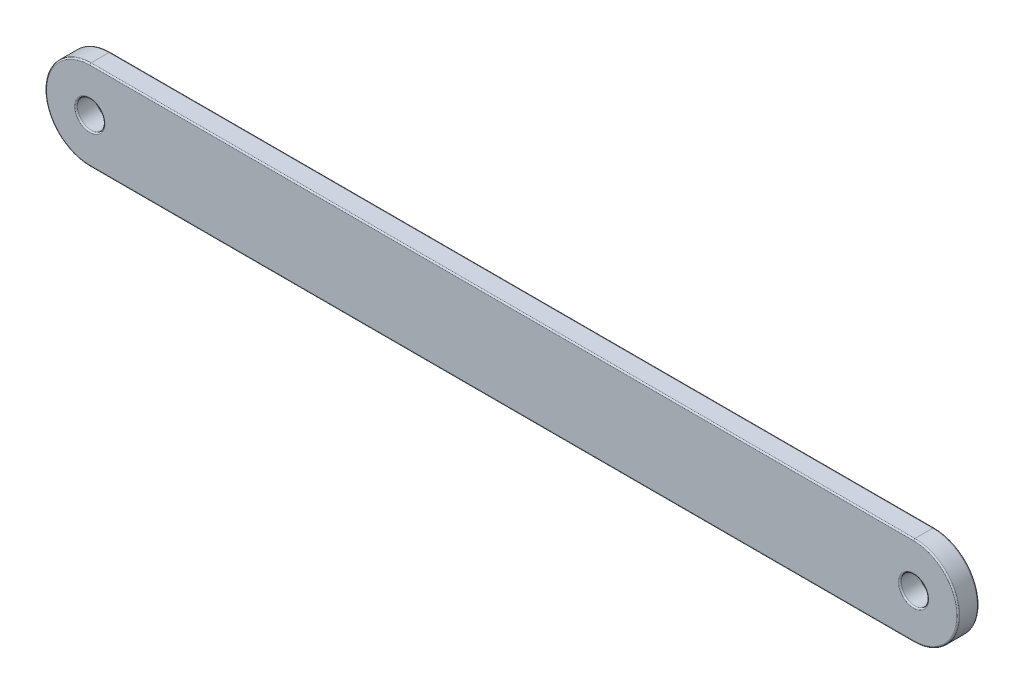
ISO-10303-21;
HEADER;
FILE_DESCRIPTION(('STEP AP214'),'2;1');
FILE_NAME('part.step','',(''),(''),'','','');
FILE_SCHEMA(('AUTOMOTIVE_DESIGN { 1 0 10303 214 1 1 1 1 }'));
ENDSEC;
DATA;
#1=APPLICATION_CONTEXT('core data for automotive mechanical design processes');
#2=APPLICATION_PROTOCOL_DEFINITION('international standard','automotive_design',2000,#1);
#3=PRODUCT_CONTEXT('',#1,'mechanical');
#4=PRODUCT('Part','Part','',(#3));
#5=PRODUCT_RELATED_PRODUCT_CATEGORY('part','',(#4));
#6=PRODUCT_DEFINITION_FORMATION('','',#4);
#7=PRODUCT_DEFINITION_CONTEXT('part definition',#1,'design');
#8=PRODUCT_DEFINITION('design','',#6,#7);
#9=PRODUCT_DEFINITION_SHAPE('','',#8);
#10=(LENGTH_UNIT() NAMED_UNIT(*) SI_UNIT(.MILLI.,.METRE.));
#11=(NAMED_UNIT(*) PLANE_ANGLE_UNIT() SI_UNIT($,.RADIAN.));
#12=(NAMED_UNIT(*) SI_UNIT($,.STERADIAN.) SOLID_ANGLE_UNIT());
#13=UNCERTAINTY_MEASURE_WITH_UNIT(LENGTH_MEASURE(1.E-05),#10,'distance_accuracy_value','');
#14=(GEOMETRIC_REPRESENTATION_CONTEXT(3) GLOBAL_UNCERTAINTY_ASSIGNED_CONTEXT((#13)) GLOBAL_UNIT_ASSIGNED_CONTEXT((#10,
#11,#12)) REPRESENTATION_CONTEXT('',''));
#15=CARTESIAN_POINT('',(0.,0.,0.));
#16=DIRECTION('',(0.,0.,1.));
#17=DIRECTION('',(1.,0.,0.));
#18=AXIS2_PLACEMENT_3D('',#15,#16,#17);
#19=CARTESIAN_POINT('',(-30.,0.,0.75));
#20=DIRECTION('',(0.,0.,1.));
#21=DIRECTION('',(1.,0.,0.));
#22=AXIS2_PLACEMENT_3D('',#19,#20,#21);
#23=PLANE('',#22);
#24=CARTESIAN_POINT('',(30.,0.,0.75));
#25=DIRECTION('',(0.,0.,1.));
#26=DIRECTION('',(1.,0.,0.));
#27=AXIS2_PLACEMENT_3D('',#24,#25,#26);
#28=CIRCLE('',#27,1.1);
#29=CARTESIAN_POINT('',(31.1,0.,0.75));
#30=VERTEX_POINT('',#29);
#31=EDGE_CURVE('E179',#30,#30,#28,.F.);
#32=ORIENTED_EDGE('',*,*,#31,.T.);
#33=EDGE_LOOP('',(#32));
#34=FACE_BOUND('',#33,.T.);
#35=CARTESIAN_POINT('',(-30.,0.,0.75));
#36=DIRECTION('',(0.,0.,1.));
#37=DIRECTION('',(1.,0.,0.));
#38=AXIS2_PLACEMENT_3D('',#35,#36,#37);
#39=CIRCLE('',#38,1.1);
#40=CARTESIAN_POINT('',(-28.9,0.,0.75));
#41=VERTEX_POINT('',#40);
#42=EDGE_CURVE('E175',#41,#41,#39,.F.);
#43=ORIENTED_EDGE('',*,*,#42,.T.);
#44=EDGE_LOOP('',(#43));
#45=FACE_BOUND('',#44,.T.);
#46=DIRECTION('',(-1.,0.,0.));
#47=VECTOR('',#46,1.);
#48=CARTESIAN_POINT('',(-30.,3.15,0.75));
#49=LINE('',#48,#47);
#50=CARTESIAN_POINT('',(30.,3.15000000000001,0.75));
#51=VERTEX_POINT('',#50);
#52=CARTESIAN_POINT('',(-30.,3.15,0.75));
#53=VERTEX_POINT('',#52);
#54=EDGE_CURVE('E162',#51,#53,#49,.T.);
#55=ORIENTED_EDGE('',*,*,#54,.T.);
#56=CARTESIAN_POINT('',(-30.,0.,0.75));
#57=DIRECTION('',(0.,0.,1.));
#58=DIRECTION('',(1.,0.,0.));
#59=AXIS2_PLACEMENT_3D('',#56,#57,#58);
#60=CIRCLE('',#59,3.15);
#61=CARTESIAN_POINT('',(-30.,-3.15,0.75));
#62=VERTEX_POINT('',#61);
#63=EDGE_CURVE('E171',#53,#62,#60,.T.);
#64=ORIENTED_EDGE('',*,*,#63,.T.);
#65=DIRECTION('',(1.,0.,0.));
#66=VECTOR('',#65,1.);
#67=CARTESIAN_POINT('',(30.,-3.14999999999999,0.75));
#68=LINE('',#67,#66);
#69=CARTESIAN_POINT('',(30.,-3.14999999999999,0.75));
#70=VERTEX_POINT('',#69);
#71=EDGE_CURVE('E168',#62,#70,#68,.T.);
#72=ORIENTED_EDGE('',*,*,#71,.T.);
#73=CARTESIAN_POINT('',(30.,0.,0.75));
#74=DIRECTION('',(0.,0.,1.));
#75=DIRECTION('',(1.,0.,0.));
#76=AXIS2_PLACEMENT_3D('',#73,#74,#75);
#77=CIRCLE('',#76,3.15);
#78=EDGE_CURVE('E165',#70,#51,#77,.T.);
#79=ORIENTED_EDGE('',*,*,#78,.T.);
#80=EDGE_LOOP('',(#55,#64,#72,#79));
#81=FACE_BOUND('',#80,.T.);
#82=ADVANCED_FACE('F43',(#34,#45,#81),#23,.T.);
#83=CARTESIAN_POINT('',(-30.,0.,-0.75));
#84=DIRECTION('',(0.,0.,1.));
#85=DIRECTION('',(1.,0.,0.));
#86=AXIS2_PLACEMENT_3D('',#83,#84,#85);
#87=PLANE('',#86);
#88=CARTESIAN_POINT('',(30.,0.,-0.75));
#89=DIRECTION('',(0.,0.,1.));
#90=DIRECTION('',(1.,0.,0.));
#91=AXIS2_PLACEMENT_3D('',#88,#89,#90);
#92=CIRCLE('',#91,1.1);
#93=CARTESIAN_POINT('',(31.1,0.,-0.75));
#94=VERTEX_POINT('',#93);
#95=EDGE_CURVE('E146',#94,#94,#92,.T.);
#96=ORIENTED_EDGE('',*,*,#95,.T.);
#97=EDGE_LOOP('',(#96));
#98=FACE_BOUND('',#97,.T.);
#99=CARTESIAN_POINT('',(-30.,0.,-0.75));
#100=DIRECTION('',(0.,0.,1.));
#101=DIRECTION('',(1.,0.,0.));
#102=AXIS2_PLACEMENT_3D('',#99,#100,#101);
#103=CIRCLE('',#102,1.1);
#104=CARTESIAN_POINT('',(-28.9,0.,-0.75));
#105=VERTEX_POINT('',#104);
#106=EDGE_CURVE('E141',#105,#105,#103,.T.);
#107=ORIENTED_EDGE('',*,*,#106,.T.);
#108=EDGE_LOOP('',(#107));
#109=FACE_BOUND('',#108,.T.);
#110=DIRECTION('',(1.,0.,0.));
#111=VECTOR('',#110,1.);
#112=CARTESIAN_POINT('',(-30.,-3.15,-0.75));
#113=LINE('',#112,#111);
#114=CARTESIAN_POINT('',(30.,-3.14999999999999,-0.75));
#115=VERTEX_POINT('',#114);
#116=CARTESIAN_POINT('',(-30.,-3.15,-0.75));
#117=VERTEX_POINT('',#116);
#118=EDGE_CURVE('E139',#115,#117,#113,.F.);
#119=ORIENTED_EDGE('',*,*,#118,.T.);
#120=CARTESIAN_POINT('',(-30.,0.,-0.75));
#121=DIRECTION('',(0.,0.,1.));
#122=DIRECTION('',(1.,0.,0.));
#123=AXIS2_PLACEMENT_3D('',#120,#121,#122);
#124=CIRCLE('',#123,3.15);
#125=CARTESIAN_POINT('',(-30.,3.15,-0.75));
#126=VERTEX_POINT('',#125);
#127=EDGE_CURVE('E116',#117,#126,#124,.F.);
#128=ORIENTED_EDGE('',*,*,#127,.T.);
#129=DIRECTION('',(-1.,0.,0.));
#130=VECTOR('',#129,1.);
#131=CARTESIAN_POINT('',(-30.,3.15,-0.75));
#132=LINE('',#131,#130);
#133=CARTESIAN_POINT('',(30.,3.15000000000001,-0.75));
#134=VERTEX_POINT('',#133);
#135=EDGE_CURVE('E127',#126,#134,#132,.F.);
#136=ORIENTED_EDGE('',*,*,#135,.T.);
#137=CARTESIAN_POINT('',(30.,0.,-0.75));
#138=DIRECTION('',(0.,0.,1.));
#139=DIRECTION('',(1.,0.,0.));
#140=AXIS2_PLACEMENT_3D('',#137,#138,#139);
#141=CIRCLE('',#140,3.15);
#142=EDGE_CURVE('E134',#134,#115,#141,.F.);
#143=ORIENTED_EDGE('',*,*,#142,.T.);
#144=EDGE_LOOP('',(#119,#128,#136,#143));
#145=FACE_BOUND('',#144,.T.);
#146=ADVANCED_FACE('F137',(#98,#109,#145),#87,.F.);
#147=CARTESIAN_POINT('',(-30.,0.,0.75));
#148=DIRECTION('',(0.,0.,-1.));
#149=DIRECTION('',(-1.,0.,0.));
#150=AXIS2_PLACEMENT_3D('',#147,#148,#149);
#151=CYLINDRICAL_SURFACE('',#150,3.25);
#152=DIRECTION('',(0.,0.,-1.));
#153=VECTOR('',#152,1.);
#154=CARTESIAN_POINT('',(-30.,3.25,0.75));
#155=LINE('',#154,#153);
#156=CARTESIAN_POINT('',(-30.,3.25,0.65));
#157=VERTEX_POINT('',#156);
#158=CARTESIAN_POINT('',(-30.,3.25,-0.65));
#159=VERTEX_POINT('',#158);
#160=EDGE_CURVE('E217',#157,#159,#155,.T.);
#161=ORIENTED_EDGE('',*,*,#160,.T.);
#162=CARTESIAN_POINT('',(-30.,0.,-0.65));
#163=DIRECTION('',(0.,0.,1.));
#164=DIRECTION('',(1.,0.,0.));
#165=AXIS2_PLACEMENT_3D('',#162,#163,#164);
#166=CIRCLE('',#165,3.25);
#167=CARTESIAN_POINT('',(-30.,-3.25,-0.65));
#168=VERTEX_POINT('',#167);
#169=EDGE_CURVE('E119',#159,#168,#166,.T.);
#170=ORIENTED_EDGE('',*,*,#169,.T.);
#171=DIRECTION('',(0.,0.,-1.));
#172=VECTOR('',#171,1.);
#173=CARTESIAN_POINT('',(-30.,-3.25,0.75));
#174=LINE('',#173,#172);
#175=CARTESIAN_POINT('',(-30.,-3.25,0.65));
#176=VERTEX_POINT('',#175);
#177=EDGE_CURVE('E135',#176,#168,#174,.T.);
#178=ORIENTED_EDGE('',*,*,#177,.F.);
#179=CARTESIAN_POINT('',(-30.,0.,0.65));
#180=DIRECTION('',(0.,0.,1.));
#181=DIRECTION('',(1.,0.,0.));
#182=AXIS2_PLACEMENT_3D('',#179,#180,#181);
#183=CIRCLE('',#182,3.25);
#184=EDGE_CURVE('E191',#176,#157,#183,.F.);
#185=ORIENTED_EDGE('',*,*,#184,.T.);
#186=EDGE_LOOP('',(#161,#170,#178,#185));
#187=FACE_BOUND('',#186,.T.);
#188=ADVANCED_FACE('F264',(#187),#151,.T.);
#189=CARTESIAN_POINT('',(-30.,-3.25,0.75));
#190=DIRECTION('',(0.,1.,0.));
#191=DIRECTION('',(-1.,0.,0.));
#192=AXIS2_PLACEMENT_3D('',#189,#190,#191);
#193=PLANE('',#192);
#194=ORIENTED_EDGE('',*,*,#177,.T.);
#195=DIRECTION('',(1.,0.,0.));
#196=VECTOR('',#195,1.);
#197=CARTESIAN_POINT('',(-30.,-3.25,-0.65));
#198=LINE('',#197,#196);
#199=CARTESIAN_POINT('',(30.,-3.24999999999999,-0.65));
#200=VERTEX_POINT('',#199);
#201=EDGE_CURVE('E200',#168,#200,#198,.T.);
#202=ORIENTED_EDGE('',*,*,#201,.T.);
#203=DIRECTION('',(0.,0.,-1.));
#204=VECTOR('',#203,1.);
#205=CARTESIAN_POINT('',(30.,-3.24999999999999,0.75));
#206=LINE('',#205,#204);
#207=CARTESIAN_POINT('',(30.,-3.24999999999999,0.65));
#208=VERTEX_POINT('',#207);
#209=EDGE_CURVE('E242',#208,#200,#206,.T.);
#210=ORIENTED_EDGE('',*,*,#209,.F.);
#211=DIRECTION('',(1.,0.,0.));
#212=VECTOR('',#211,1.);
#213=CARTESIAN_POINT('',(-30.,-3.25,0.65));
#214=LINE('',#213,#212);
#215=EDGE_CURVE('E197',#208,#176,#214,.F.);
#216=ORIENTED_EDGE('',*,*,#215,.T.);
#217=EDGE_LOOP('',(#194,#202,#210,#216));
#218=FACE_BOUND('',#217,.T.);
#219=ADVANCED_FACE('F246',(#218),#193,.F.);
#220=CARTESIAN_POINT('',(30.,0.,0.75));
#221=DIRECTION('',(0.,0.,-1.));
#222=DIRECTION('',(-1.,0.,0.));
#223=AXIS2_PLACEMENT_3D('',#220,#221,#222);
#224=CYLINDRICAL_SURFACE('',#223,3.25);
#225=ORIENTED_EDGE('',*,*,#209,.T.);
#226=CARTESIAN_POINT('',(30.,0.,-0.65));
#227=DIRECTION('',(0.,0.,1.));
#228=DIRECTION('',(1.,0.,0.));
#229=AXIS2_PLACEMENT_3D('',#226,#227,#228);
#230=CIRCLE('',#229,3.25);
#231=CARTESIAN_POINT('',(30.,3.25000000000001,-0.65));
#232=VERTEX_POINT('',#231);
#233=EDGE_CURVE('E61',#200,#232,#230,.T.);
#234=ORIENTED_EDGE('',*,*,#233,.T.);
#235=DIRECTION('',(0.,0.,-1.));
#236=VECTOR('',#235,1.);
#237=CARTESIAN_POINT('',(30.,3.25000000000001,0.75));
#238=LINE('',#237,#236);
#239=CARTESIAN_POINT('',(30.,3.25000000000001,0.65));
#240=VERTEX_POINT('',#239);
#241=EDGE_CURVE('E243',#240,#232,#238,.T.);
#242=ORIENTED_EDGE('',*,*,#241,.F.);
#243=CARTESIAN_POINT('',(30.,0.,0.65));
#244=DIRECTION('',(0.,0.,1.));
#245=DIRECTION('',(1.,0.,0.));
#246=AXIS2_PLACEMENT_3D('',#243,#244,#245);
#247=CIRCLE('',#246,3.25);
#248=EDGE_CURVE('E203',#240,#208,#247,.F.);
#249=ORIENTED_EDGE('',*,*,#248,.T.);
#250=EDGE_LOOP('',(#225,#234,#242,#249));
#251=FACE_BOUND('',#250,.T.);
#252=ADVANCED_FACE('F241',(#251),#224,.T.);
#253=CARTESIAN_POINT('',(-30.,3.25,0.75));
#254=DIRECTION('',(0.,-1.,0.));
#255=DIRECTION('',(1.,0.,0.));
#256=AXIS2_PLACEMENT_3D('',#253,#254,#255);
#257=PLANE('',#256);
#258=ORIENTED_EDGE('',*,*,#160,.F.);
#259=DIRECTION('',(-1.,0.,0.));
#260=VECTOR('',#259,1.);
#261=CARTESIAN_POINT('',(30.,3.25000000000001,0.65));
#262=LINE('',#261,#260);
#263=EDGE_CURVE('E11',#157,#240,#262,.F.);
#264=ORIENTED_EDGE('',*,*,#263,.T.);
#265=ORIENTED_EDGE('',*,*,#241,.T.);
#266=DIRECTION('',(-1.,0.,0.));
#267=VECTOR('',#266,1.);
#268=CARTESIAN_POINT('',(-30.,3.25,-0.65));
#269=LINE('',#268,#267);
#270=EDGE_CURVE('E53',#232,#159,#269,.T.);
#271=ORIENTED_EDGE('',*,*,#270,.T.);
#272=EDGE_LOOP('',(#258,#264,#265,#271));
#273=FACE_BOUND('',#272,.T.);
#274=ADVANCED_FACE('F267',(#273),#257,.F.);
#275=CARTESIAN_POINT('',(-30.,0.,0.75));
#276=DIRECTION('',(0.,0.,-1.));
#277=DIRECTION('',(-1.,0.,0.));
#278=AXIS2_PLACEMENT_3D('',#275,#276,#277);
#279=CYLINDRICAL_SURFACE('',#278,1.);
#280=CARTESIAN_POINT('',(-30.,0.,-0.65));
#281=DIRECTION('',(0.,0.,1.));
#282=DIRECTION('',(1.,0.,0.));
#283=AXIS2_PLACEMENT_3D('',#280,#281,#282);
#284=CIRCLE('',#283,1.);
#285=CARTESIAN_POINT('',(-29.,0.,-0.65));
#286=VERTEX_POINT('',#285);
#287=EDGE_CURVE('E187',#286,#286,#284,.F.);
#288=ORIENTED_EDGE('',*,*,#287,.T.);
#289=EDGE_LOOP('',(#288));
#290=FACE_BOUND('',#289,.T.);
#291=CARTESIAN_POINT('',(-30.,0.,0.65));
#292=DIRECTION('',(0.,0.,1.));
#293=DIRECTION('',(1.,0.,0.));
#294=AXIS2_PLACEMENT_3D('',#291,#292,#293);
#295=CIRCLE('',#294,1.);
#296=CARTESIAN_POINT('',(-29.,0.,0.65));
#297=VERTEX_POINT('',#296);
#298=EDGE_CURVE('E183',#297,#297,#295,.T.);
#299=ORIENTED_EDGE('',*,*,#298,.T.);
#300=EDGE_LOOP('',(#299));
#301=FACE_BOUND('',#300,.T.);
#302=ADVANCED_FACE('F269',(#290,#301),#279,.F.);
#303=CARTESIAN_POINT('',(30.,0.,0.75));
#304=DIRECTION('',(0.,0.,-1.));
#305=DIRECTION('',(-1.,0.,0.));
#306=AXIS2_PLACEMENT_3D('',#303,#304,#305);
#307=CYLINDRICAL_SURFACE('',#306,1.);
#308=CARTESIAN_POINT('',(30.,0.,-0.65));
#309=DIRECTION('',(0.,0.,1.));
#310=DIRECTION('',(1.,0.,0.));
#311=AXIS2_PLACEMENT_3D('',#308,#309,#310);
#312=CIRCLE('',#311,1.);
#313=CARTESIAN_POINT('',(31.,0.,-0.65));
#314=VERTEX_POINT('',#313);
#315=EDGE_CURVE('E158',#314,#314,#312,.F.);
#316=ORIENTED_EDGE('',*,*,#315,.T.);
#317=EDGE_LOOP('',(#316));
#318=FACE_BOUND('',#317,.T.);
#319=CARTESIAN_POINT('',(30.,0.,0.65));
#320=DIRECTION('',(0.,0.,1.));
#321=DIRECTION('',(1.,0.,0.));
#322=AXIS2_PLACEMENT_3D('',#319,#320,#321);
#323=CIRCLE('',#322,1.);
#324=CARTESIAN_POINT('',(31.,0.,0.65));
#325=VERTEX_POINT('',#324);
#326=EDGE_CURVE('E154',#325,#325,#323,.T.);
#327=ORIENTED_EDGE('',*,*,#326,.T.);
#328=EDGE_LOOP('',(#327));
#329=FACE_BOUND('',#328,.T.);
#330=ADVANCED_FACE('F275',(#318,#329),#307,.F.);
#331=CARTESIAN_POINT('',(30.,0.,-0.65));
#332=DIRECTION('',(0.,0.,1.));
#333=DIRECTION('',(1.,0.,0.));
#334=AXIS2_PLACEMENT_3D('',#331,#332,#333);
#335=TOROIDAL_SURFACE('',#334,1.1,0.1);
#336=ORIENTED_EDGE('',*,*,#315,.F.);
#337=EDGE_LOOP('',(#336));
#338=FACE_BOUND('',#337,.T.);
#339=ORIENTED_EDGE('',*,*,#95,.F.);
#340=EDGE_LOOP('',(#339));
#341=FACE_BOUND('',#340,.T.);
#342=ADVANCED_FACE('F290',(#338,#341),#335,.T.);
#343=CARTESIAN_POINT('',(30.,0.,0.65));
#344=DIRECTION('',(0.,0.,1.));
#345=DIRECTION('',(1.,0.,0.));
#346=AXIS2_PLACEMENT_3D('',#343,#344,#345);
#347=TOROIDAL_SURFACE('',#346,1.1,0.1);
#348=ORIENTED_EDGE('',*,*,#31,.F.);
#349=EDGE_LOOP('',(#348));
#350=FACE_BOUND('',#349,.T.);
#351=ORIENTED_EDGE('',*,*,#326,.F.);
#352=EDGE_LOOP('',(#351));
#353=FACE_BOUND('',#352,.T.);
#354=ADVANCED_FACE('F295',(#350,#353),#347,.T.);
#355=CARTESIAN_POINT('',(-30.,0.,-0.65));
#356=DIRECTION('',(0.,0.,1.));
#357=DIRECTION('',(1.,0.,0.));
#358=AXIS2_PLACEMENT_3D('',#355,#356,#357);
#359=TOROIDAL_SURFACE('',#358,1.1,0.1);
#360=ORIENTED_EDGE('',*,*,#287,.F.);
#361=EDGE_LOOP('',(#360));
#362=FACE_BOUND('',#361,.T.);
#363=ORIENTED_EDGE('',*,*,#106,.F.);
#364=EDGE_LOOP('',(#363));
#365=FACE_BOUND('',#364,.T.);
#366=ADVANCED_FACE('F303',(#362,#365),#359,.T.);
#367=CARTESIAN_POINT('',(-30.,0.,0.65));
#368=DIRECTION('',(0.,0.,1.));
#369=DIRECTION('',(1.,0.,0.));
#370=AXIS2_PLACEMENT_3D('',#367,#368,#369);
#371=TOROIDAL_SURFACE('',#370,1.1,0.1);
#372=ORIENTED_EDGE('',*,*,#42,.F.);
#373=EDGE_LOOP('',(#372));
#374=FACE_BOUND('',#373,.T.);
#375=ORIENTED_EDGE('',*,*,#298,.F.);
#376=EDGE_LOOP('',(#375));
#377=FACE_BOUND('',#376,.T.);
#378=ADVANCED_FACE('F309',(#374,#377),#371,.T.);
#379=CARTESIAN_POINT('',(30.,0.,-0.65));
#380=DIRECTION('',(0.,0.,1.));
#381=DIRECTION('',(1.,0.,0.));
#382=AXIS2_PLACEMENT_3D('',#379,#380,#381);
#383=TOROIDAL_SURFACE('',#382,3.15,0.1);
#384=CARTESIAN_POINT('',(30.,-3.14999999999999,-0.65));
#385=DIRECTION('',(-1.,0.,0.));
#386=DIRECTION('',(0.,0.,1.));
#387=AXIS2_PLACEMENT_3D('',#384,#385,#386);
#388=CIRCLE('',#387,0.1);
#389=EDGE_CURVE('E123',#115,#200,#388,.T.);
#390=ORIENTED_EDGE('',*,*,#389,.F.);
#391=ORIENTED_EDGE('',*,*,#142,.F.);
#392=CARTESIAN_POINT('',(30.,3.15000000000001,-0.65));
#393=DIRECTION('',(-1.,0.,0.));
#394=DIRECTION('',(0.,0.,1.));
#395=AXIS2_PLACEMENT_3D('',#392,#393,#394);
#396=CIRCLE('',#395,0.1);
#397=EDGE_CURVE('E130',#232,#134,#396,.T.);
#398=ORIENTED_EDGE('',*,*,#397,.F.);
#399=ORIENTED_EDGE('',*,*,#233,.F.);
#400=EDGE_LOOP('',(#390,#391,#398,#399));
#401=FACE_BOUND('',#400,.T.);
#402=ADVANCED_FACE('F259',(#401),#383,.T.);
#403=CARTESIAN_POINT('',(-30.,3.15,-0.65));
#404=DIRECTION('',(-1.,0.,0.));
#405=DIRECTION('',(0.,-1.,0.));
#406=AXIS2_PLACEMENT_3D('',#403,#404,#405);
#407=CYLINDRICAL_SURFACE('',#406,0.1);
#408=ORIENTED_EDGE('',*,*,#397,.T.);
#409=ORIENTED_EDGE('',*,*,#135,.F.);
#410=CARTESIAN_POINT('',(-30.,3.15,-0.65));
#411=DIRECTION('',(-1.,0.,0.));
#412=DIRECTION('',(0.,0.,1.));
#413=AXIS2_PLACEMENT_3D('',#410,#411,#412);
#414=CIRCLE('',#413,0.1);
#415=EDGE_CURVE('E112',#159,#126,#414,.T.);
#416=ORIENTED_EDGE('',*,*,#415,.F.);
#417=ORIENTED_EDGE('',*,*,#270,.F.);
#418=EDGE_LOOP('',(#408,#409,#416,#417));
#419=FACE_BOUND('',#418,.T.);
#420=ADVANCED_FACE('F128',(#419),#407,.T.);
#421=CARTESIAN_POINT('',(-30.,-3.15,-0.65));
#422=DIRECTION('',(1.,0.,0.));
#423=DIRECTION('',(0.,1.,0.));
#424=AXIS2_PLACEMENT_3D('',#421,#422,#423);
#425=CYLINDRICAL_SURFACE('',#424,0.1);
#426=ORIENTED_EDGE('',*,*,#389,.T.);
#427=ORIENTED_EDGE('',*,*,#201,.F.);
#428=CARTESIAN_POINT('',(-30.,-3.15,-0.65));
#429=DIRECTION('',(-1.,0.,0.));
#430=DIRECTION('',(0.,0.,1.));
#431=AXIS2_PLACEMENT_3D('',#428,#429,#430);
#432=CIRCLE('',#431,0.1);
#433=EDGE_CURVE('E124',#117,#168,#432,.T.);
#434=ORIENTED_EDGE('',*,*,#433,.F.);
#435=ORIENTED_EDGE('',*,*,#118,.F.);
#436=EDGE_LOOP('',(#426,#427,#434,#435));
#437=FACE_BOUND('',#436,.T.);
#438=ADVANCED_FACE('F261',(#437),#425,.T.);
#439=CARTESIAN_POINT('',(-30.,0.,-0.65));
#440=DIRECTION('',(0.,0.,1.));
#441=DIRECTION('',(1.,0.,0.));
#442=AXIS2_PLACEMENT_3D('',#439,#440,#441);
#443=TOROIDAL_SURFACE('',#442,3.15,0.1);
#444=ORIENTED_EDGE('',*,*,#415,.T.);
#445=ORIENTED_EDGE('',*,*,#127,.F.);
#446=ORIENTED_EDGE('',*,*,#433,.T.);
#447=ORIENTED_EDGE('',*,*,#169,.F.);
#448=EDGE_LOOP('',(#444,#445,#446,#447));
#449=FACE_BOUND('',#448,.T.);
#450=ADVANCED_FACE('F114',(#449),#443,.T.);
#451=CARTESIAN_POINT('',(30.,0.,0.65));
#452=DIRECTION('',(0.,0.,1.));
#453=DIRECTION('',(1.,0.,0.));
#454=AXIS2_PLACEMENT_3D('',#451,#452,#453);
#455=TOROIDAL_SURFACE('',#454,3.15,0.1);
#456=CARTESIAN_POINT('',(30.,-3.14999999999999,0.65));
#457=DIRECTION('',(-1.,0.,0.));
#458=DIRECTION('',(0.,0.,1.));
#459=AXIS2_PLACEMENT_3D('',#456,#457,#458);
#460=CIRCLE('',#459,0.1);
#461=EDGE_CURVE('E223',#208,#70,#460,.T.);
#462=ORIENTED_EDGE('',*,*,#461,.F.);
#463=ORIENTED_EDGE('',*,*,#248,.F.);
#464=CARTESIAN_POINT('',(30.,3.15000000000001,0.65));
#465=DIRECTION('',(-1.,0.,0.));
#466=DIRECTION('',(0.,0.,1.));
#467=AXIS2_PLACEMENT_3D('',#464,#465,#466);
#468=CIRCLE('',#467,0.1);
#469=EDGE_CURVE('E47',#51,#240,#468,.T.);
#470=ORIENTED_EDGE('',*,*,#469,.F.);
#471=ORIENTED_EDGE('',*,*,#78,.F.);
#472=EDGE_LOOP('',(#462,#463,#470,#471));
#473=FACE_BOUND('',#472,.T.);
#474=ADVANCED_FACE('F45',(#473),#455,.T.);
#475=CARTESIAN_POINT('',(-30.,3.15,0.65));
#476=DIRECTION('',(1.,0.,0.));
#477=DIRECTION('',(0.,1.,0.));
#478=AXIS2_PLACEMENT_3D('',#475,#476,#477);
#479=CYLINDRICAL_SURFACE('',#478,0.1);
#480=ORIENTED_EDGE('',*,*,#469,.T.);
#481=ORIENTED_EDGE('',*,*,#263,.F.);
#482=CARTESIAN_POINT('',(-30.,3.15,0.65));
#483=DIRECTION('',(-1.,0.,0.));
#484=DIRECTION('',(0.,0.,1.));
#485=AXIS2_PLACEMENT_3D('',#482,#483,#484);
#486=CIRCLE('',#485,0.1);
#487=EDGE_CURVE('E221',#53,#157,#486,.T.);
#488=ORIENTED_EDGE('',*,*,#487,.F.);
#489=ORIENTED_EDGE('',*,*,#54,.F.);
#490=EDGE_LOOP('',(#480,#481,#488,#489));
#491=FACE_BOUND('',#490,.T.);
#492=ADVANCED_FACE('F235',(#491),#479,.T.);
#493=CARTESIAN_POINT('',(-30.,-3.15,0.65));
#494=DIRECTION('',(-1.,0.,0.));
#495=DIRECTION('',(0.,-1.,0.));
#496=AXIS2_PLACEMENT_3D('',#493,#494,#495);
#497=CYLINDRICAL_SURFACE('',#496,0.1);
#498=ORIENTED_EDGE('',*,*,#461,.T.);
#499=ORIENTED_EDGE('',*,*,#71,.F.);
#500=CARTESIAN_POINT('',(-30.,-3.15,0.65));
#501=DIRECTION('',(-1.,0.,0.));
#502=DIRECTION('',(0.,0.,1.));
#503=AXIS2_PLACEMENT_3D('',#500,#501,#502);
#504=CIRCLE('',#503,0.1);
#505=EDGE_CURVE('E218',#176,#62,#504,.T.);
#506=ORIENTED_EDGE('',*,*,#505,.F.);
#507=ORIENTED_EDGE('',*,*,#215,.F.);
#508=EDGE_LOOP('',(#498,#499,#506,#507));
#509=FACE_BOUND('',#508,.T.);
#510=ADVANCED_FACE('F329',(#509),#497,.T.);
#511=CARTESIAN_POINT('',(-30.,0.,0.65));
#512=DIRECTION('',(0.,0.,1.));
#513=DIRECTION('',(1.,0.,0.));
#514=AXIS2_PLACEMENT_3D('',#511,#512,#513);
#515=TOROIDAL_SURFACE('',#514,3.15,0.1);
#516=ORIENTED_EDGE('',*,*,#487,.T.);
#517=ORIENTED_EDGE('',*,*,#184,.F.);
#518=ORIENTED_EDGE('',*,*,#505,.T.);
#519=ORIENTED_EDGE('',*,*,#63,.F.);
#520=EDGE_LOOP('',(#516,#517,#518,#519));
#521=FACE_BOUND('',#520,.T.);
#522=ADVANCED_FACE('F326',(#521),#515,.T.);
#523=CLOSED_SHELL('',(#82,#146,#188,#219,#252,#274,#302,#330,#342,#354,#366,#378,#402,#420,#438,
#450,#474,#492,#510,#522));
#524=MANIFOLD_SOLID_BREP('B2',#523);
#525=ADVANCED_BREP_SHAPE_REPRESENTATION('',(#18,#524),#14);
#526=SHAPE_DEFINITION_REPRESENTATION(#9,#525);
ENDSEC;
END-ISO-10303-21;
